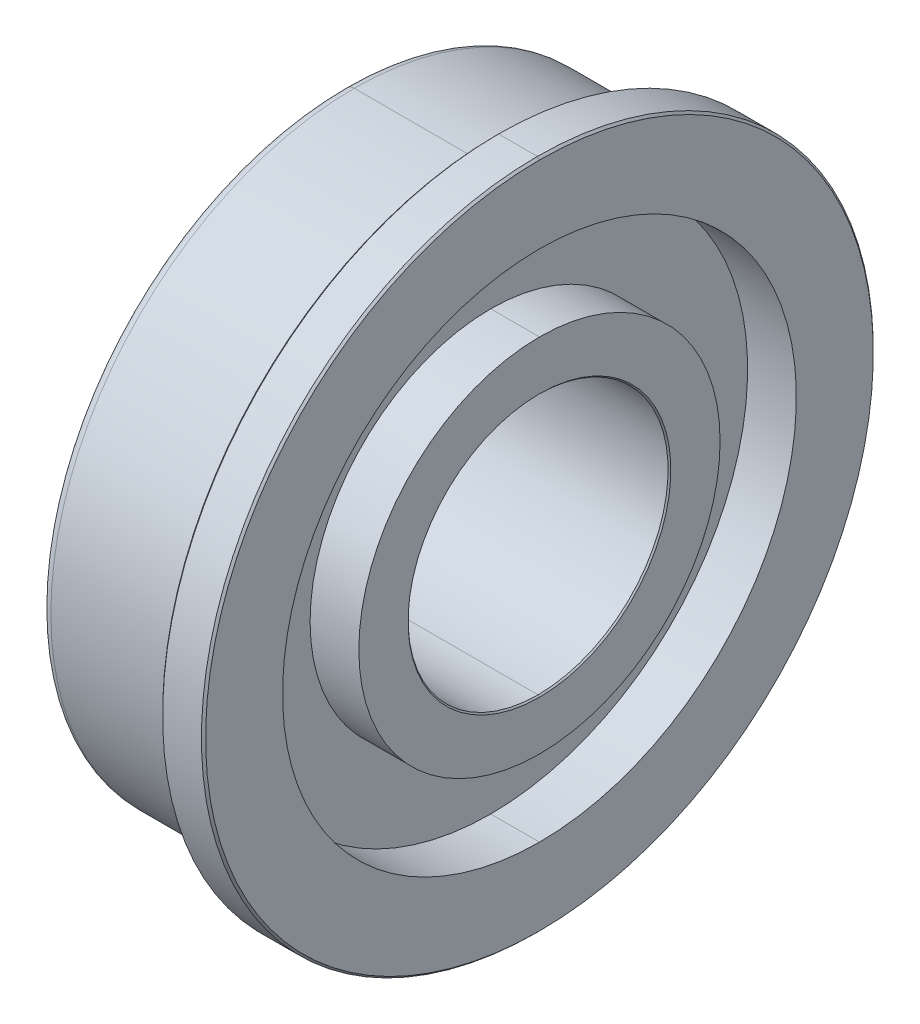
ISO-10303-21;
HEADER;
FILE_DESCRIPTION(('STEP AP214'),'2;1');
FILE_NAME('part.step','',(''),(''),'','','');
FILE_SCHEMA(('AUTOMOTIVE_DESIGN { 1 0 10303 214 1 1 1 1 }'));
ENDSEC;
DATA;
#1=APPLICATION_CONTEXT('core data for automotive mechanical design processes');
#2=APPLICATION_PROTOCOL_DEFINITION('international standard','automotive_design',2000,#1);
#3=PRODUCT_CONTEXT('',#1,'mechanical');
#4=PRODUCT('Part','Part','',(#3));
#5=PRODUCT_RELATED_PRODUCT_CATEGORY('part','',(#4));
#6=PRODUCT_DEFINITION_FORMATION('','',#4);
#7=PRODUCT_DEFINITION_CONTEXT('part definition',#1,'design');
#8=PRODUCT_DEFINITION('design','',#6,#7);
#9=PRODUCT_DEFINITION_SHAPE('','',#8);
#10=(LENGTH_UNIT() NAMED_UNIT(*) SI_UNIT(.MILLI.,.METRE.));
#11=(NAMED_UNIT(*) PLANE_ANGLE_UNIT() SI_UNIT($,.RADIAN.));
#12=(NAMED_UNIT(*) SI_UNIT($,.STERADIAN.) SOLID_ANGLE_UNIT());
#13=UNCERTAINTY_MEASURE_WITH_UNIT(LENGTH_MEASURE(1.E-05),#10,'distance_accuracy_value','');
#14=(GEOMETRIC_REPRESENTATION_CONTEXT(3) GLOBAL_UNCERTAINTY_ASSIGNED_CONTEXT((#13)) GLOBAL_UNIT_ASSIGNED_CONTEXT((#10,
#11,#12)) REPRESENTATION_CONTEXT('',''));
#15=CARTESIAN_POINT('',(0.,0.,0.));
#16=DIRECTION('',(0.,0.,1.));
#17=DIRECTION('',(1.,0.,0.));
#18=AXIS2_PLACEMENT_3D('',#15,#16,#17);
#19=CARTESIAN_POINT('',(-3.54584,0.,0.));
#20=DIRECTION('',(-1.,0.,0.));
#21=DIRECTION('',(0.,1.,0.));
#22=AXIS2_PLACEMENT_3D('',#19,#20,#21);
#23=CONICAL_SURFACE('',#22,4.7879,0.7853981633973);
#24=CARTESIAN_POINT('',(-3.57124,0.,0.));
#25=DIRECTION('',(-1.,0.,0.));
#26=DIRECTION('',(0.,1.,0.));
#27=AXIS2_PLACEMENT_3D('',#24,#25,#26);
#28=CIRCLE('',#27,4.8133);
#29=CARTESIAN_POINT('',(-3.57124,4.8133,0.));
#30=VERTEX_POINT('',#29);
#31=CARTESIAN_POINT('',(-3.57124,-4.8133,0.));
#32=VERTEX_POINT('',#31);
#33=EDGE_CURVE('E204',#30,#32,#28,.T.);
#34=ORIENTED_EDGE('',*,*,#33,.T.);
#35=DIRECTION('',(0.707106781186497,0.707106781186598,0.));
#36=VECTOR('',#35,1.);
#37=CARTESIAN_POINT('',(-3.57124,-4.8133,0.));
#38=LINE('',#37,#36);
#39=CARTESIAN_POINT('',(-3.52044,-4.7625,0.));
#40=VERTEX_POINT('',#39);
#41=EDGE_CURVE('E28',#32,#40,#38,.T.);
#42=ORIENTED_EDGE('',*,*,#41,.T.);
#43=CARTESIAN_POINT('',(-3.52044,0.,0.));
#44=DIRECTION('',(-1.,0.,0.));
#45=DIRECTION('',(0.,1.,0.));
#46=AXIS2_PLACEMENT_3D('',#43,#44,#45);
#47=CIRCLE('',#46,4.7625);
#48=CARTESIAN_POINT('',(-3.52044,4.7625,0.));
#49=VERTEX_POINT('',#48);
#50=EDGE_CURVE('E271',#49,#40,#47,.T.);
#51=ORIENTED_EDGE('',*,*,#50,.F.);
#52=DIRECTION('',(0.707106781186497,-0.707106781186598,0.));
#53=VECTOR('',#52,1.);
#54=CARTESIAN_POINT('',(-3.57124,4.8133,0.));
#55=LINE('',#54,#53);
#56=EDGE_CURVE('E11',#30,#49,#55,.T.);
#57=ORIENTED_EDGE('',*,*,#56,.F.);
#58=EDGE_LOOP('',(#34,#42,#51,#57));
#59=FACE_BOUND('',#58,.T.);
#60=ADVANCED_FACE('F17',(#59),#23,.F.);
#61=CARTESIAN_POINT('',(-3.54584,0.,0.));
#62=DIRECTION('',(-1.,0.,0.));
#63=DIRECTION('',(0.,1.,0.));
#64=AXIS2_PLACEMENT_3D('',#61,#62,#63);
#65=CONICAL_SURFACE('',#64,4.7879,0.7853981633973);
#66=CARTESIAN_POINT('',(-3.52044,0.,0.));
#67=DIRECTION('',(1.,0.,0.));
#68=DIRECTION('',(0.,1.,0.));
#69=AXIS2_PLACEMENT_3D('',#66,#67,#68);
#70=CIRCLE('',#69,4.7625);
#71=EDGE_CURVE('E221',#49,#40,#70,.T.);
#72=ORIENTED_EDGE('',*,*,#71,.T.);
#73=ORIENTED_EDGE('',*,*,#41,.F.);
#74=CARTESIAN_POINT('',(-3.57124,0.,0.));
#75=DIRECTION('',(1.,0.,0.));
#76=DIRECTION('',(0.,1.,0.));
#77=AXIS2_PLACEMENT_3D('',#74,#75,#76);
#78=CIRCLE('',#77,4.8133);
#79=EDGE_CURVE('E234',#30,#32,#78,.T.);
#80=ORIENTED_EDGE('',*,*,#79,.F.);
#81=ORIENTED_EDGE('',*,*,#56,.T.);
#82=EDGE_LOOP('',(#72,#73,#80,#81));
#83=FACE_BOUND('',#82,.T.);
#84=ADVANCED_FACE('F483',(#83),#65,.F.);
#85=CARTESIAN_POINT('',(-3.57124,0.,0.));
#86=DIRECTION('',(1.,0.,0.));
#87=DIRECTION('',(0.,1.,0.));
#88=AXIS2_PLACEMENT_3D('',#85,#86,#87);
#89=PLANE('',#88);
#90=ORIENTED_EDGE('',*,*,#33,.F.);
#91=ORIENTED_EDGE('',*,*,#79,.T.);
#92=EDGE_LOOP('',(#90,#91));
#93=FACE_BOUND('',#92,.T.);
#94=CARTESIAN_POINT('',(-3.57124,0.,0.));
#95=DIRECTION('',(1.,0.,0.));
#96=DIRECTION('',(0.,1.,0.));
#97=AXIS2_PLACEMENT_3D('',#94,#95,#96);
#98=CIRCLE('',#97,6.6167);
#99=CARTESIAN_POINT('',(-3.57124,6.6167,0.));
#100=VERTEX_POINT('',#99);
#101=CARTESIAN_POINT('',(-3.57124,-6.6167,0.));
#102=VERTEX_POINT('',#101);
#103=EDGE_CURVE('E293',#100,#102,#98,.T.);
#104=ORIENTED_EDGE('',*,*,#103,.F.);
#105=CARTESIAN_POINT('',(-3.57124,0.,0.));
#106=DIRECTION('',(-1.,0.,0.));
#107=DIRECTION('',(0.,1.,0.));
#108=AXIS2_PLACEMENT_3D('',#105,#106,#107);
#109=CIRCLE('',#108,6.6167);
#110=EDGE_CURVE('E201',#100,#102,#109,.T.);
#111=ORIENTED_EDGE('',*,*,#110,.T.);
#112=EDGE_LOOP('',(#104,#111));
#113=FACE_BOUND('',#112,.T.);
#114=ADVANCED_FACE('F489',(#93,#113),#89,.F.);
#115=CARTESIAN_POINT('',(-3.928364,0.,0.));
#116=DIRECTION('',(1.,0.,0.));
#117=DIRECTION('',(0.,-1.,0.));
#118=AXIS2_PLACEMENT_3D('',#115,#116,#117);
#119=CYLINDRICAL_SURFACE('',#118,6.6167);
#120=CARTESIAN_POINT('',(-1.78562,0.,0.));
#121=DIRECTION('',(-1.,0.,0.));
#122=DIRECTION('',(0.,1.,0.));
#123=AXIS2_PLACEMENT_3D('',#120,#121,#122);
#124=CIRCLE('',#123,6.6167);
#125=CARTESIAN_POINT('',(-1.78562,6.6167,0.));
#126=VERTEX_POINT('',#125);
#127=CARTESIAN_POINT('',(-1.78562,-6.6167,0.));
#128=VERTEX_POINT('',#127);
#129=EDGE_CURVE('E264',#126,#128,#124,.T.);
#130=ORIENTED_EDGE('',*,*,#129,.T.);
#131=DIRECTION('',(-1.,0.,0.));
#132=VECTOR('',#131,1.);
#133=CARTESIAN_POINT('',(-1.78562,-6.6167,0.));
#134=LINE('',#133,#132);
#135=EDGE_CURVE('E323',#128,#102,#134,.T.);
#136=ORIENTED_EDGE('',*,*,#135,.T.);
#137=ORIENTED_EDGE('',*,*,#110,.F.);
#138=DIRECTION('',(-1.,0.,0.));
#139=VECTOR('',#138,1.);
#140=CARTESIAN_POINT('',(-1.78562,6.6167,0.));
#141=LINE('',#140,#139);
#142=EDGE_CURVE('E205',#126,#100,#141,.T.);
#143=ORIENTED_EDGE('',*,*,#142,.F.);
#144=EDGE_LOOP('',(#130,#136,#137,#143));
#145=FACE_BOUND('',#144,.T.);
#146=ADVANCED_FACE('F513',(#145),#119,.T.);
#147=CARTESIAN_POINT('',(-3.928364,0.,0.));
#148=DIRECTION('',(1.,0.,0.));
#149=DIRECTION('',(0.,-1.,0.));
#150=AXIS2_PLACEMENT_3D('',#147,#148,#149);
#151=CYLINDRICAL_SURFACE('',#150,6.6167);
#152=ORIENTED_EDGE('',*,*,#103,.T.);
#153=ORIENTED_EDGE('',*,*,#135,.F.);
#154=CARTESIAN_POINT('',(-1.78562,0.,0.));
#155=DIRECTION('',(1.,0.,0.));
#156=DIRECTION('',(0.,1.,0.));
#157=AXIS2_PLACEMENT_3D('',#154,#155,#156);
#158=CIRCLE('',#157,6.6167);
#159=EDGE_CURVE('E289',#126,#128,#158,.T.);
#160=ORIENTED_EDGE('',*,*,#159,.F.);
#161=ORIENTED_EDGE('',*,*,#142,.T.);
#162=EDGE_LOOP('',(#152,#153,#160,#161));
#163=FACE_BOUND('',#162,.T.);
#164=ADVANCED_FACE('F509',(#163),#151,.T.);
#165=CARTESIAN_POINT('',(-1.78562,0.,0.));
#166=DIRECTION('',(1.,0.,0.));
#167=DIRECTION('',(0.,1.,0.));
#168=AXIS2_PLACEMENT_3D('',#165,#166,#167);
#169=PLANE('',#168);
#170=ORIENTED_EDGE('',*,*,#129,.F.);
#171=ORIENTED_EDGE('',*,*,#159,.T.);
#172=EDGE_LOOP('',(#170,#171));
#173=FACE_BOUND('',#172,.T.);
#174=CARTESIAN_POINT('',(-1.78562,0.,0.));
#175=DIRECTION('',(1.,0.,0.));
#176=DIRECTION('',(0.,1.,0.));
#177=AXIS2_PLACEMENT_3D('',#174,#175,#176);
#178=CIRCLE('',#177,9.4107);
#179=CARTESIAN_POINT('',(-1.78562,9.4107,0.));
#180=VERTEX_POINT('',#179);
#181=CARTESIAN_POINT('',(-1.78562,-9.4107,0.));
#182=VERTEX_POINT('',#181);
#183=EDGE_CURVE('E214',#180,#182,#178,.T.);
#184=ORIENTED_EDGE('',*,*,#183,.F.);
#185=CARTESIAN_POINT('',(-1.78562,0.,0.));
#186=DIRECTION('',(-1.,0.,0.));
#187=DIRECTION('',(0.,1.,0.));
#188=AXIS2_PLACEMENT_3D('',#185,#186,#187);
#189=CIRCLE('',#188,9.4107);
#190=EDGE_CURVE('E260',#180,#182,#189,.T.);
#191=ORIENTED_EDGE('',*,*,#190,.T.);
#192=EDGE_LOOP('',(#184,#191));
#193=FACE_BOUND('',#192,.T.);
#194=ADVANCED_FACE('F512',(#173,#193),#169,.F.);
#195=CARTESIAN_POINT('',(-3.928364,0.,0.));
#196=DIRECTION('',(1.,0.,0.));
#197=DIRECTION('',(0.,-1.,0.));
#198=AXIS2_PLACEMENT_3D('',#195,#196,#197);
#199=CYLINDRICAL_SURFACE('',#198,9.4107);
#200=CARTESIAN_POINT('',(-3.57124,0.,0.));
#201=DIRECTION('',(-1.,0.,0.));
#202=DIRECTION('',(0.,1.,0.));
#203=AXIS2_PLACEMENT_3D('',#200,#201,#202);
#204=CIRCLE('',#203,9.4107);
#205=CARTESIAN_POINT('',(-3.57124,9.4107,0.));
#206=VERTEX_POINT('',#205);
#207=CARTESIAN_POINT('',(-3.57124,-9.4107,0.));
#208=VERTEX_POINT('',#207);
#209=EDGE_CURVE('E215',#206,#208,#204,.T.);
#210=ORIENTED_EDGE('',*,*,#209,.T.);
#211=DIRECTION('',(1.,0.,0.));
#212=VECTOR('',#211,1.);
#213=CARTESIAN_POINT('',(-3.57124,-9.4107,0.));
#214=LINE('',#213,#212);
#215=EDGE_CURVE('E389',#208,#182,#214,.T.);
#216=ORIENTED_EDGE('',*,*,#215,.T.);
#217=ORIENTED_EDGE('',*,*,#190,.F.);
#218=DIRECTION('',(1.,0.,0.));
#219=VECTOR('',#218,1.);
#220=CARTESIAN_POINT('',(-3.57124,9.4107,0.));
#221=LINE('',#220,#219);
#222=EDGE_CURVE('E265',#206,#180,#221,.T.);
#223=ORIENTED_EDGE('',*,*,#222,.F.);
#224=EDGE_LOOP('',(#210,#216,#217,#223));
#225=FACE_BOUND('',#224,.T.);
#226=ADVANCED_FACE('F514',(#225),#199,.F.);
#227=CARTESIAN_POINT('',(-3.928364,0.,0.));
#228=DIRECTION('',(1.,0.,0.));
#229=DIRECTION('',(0.,-1.,0.));
#230=AXIS2_PLACEMENT_3D('',#227,#228,#229);
#231=CYLINDRICAL_SURFACE('',#230,9.4107);
#232=ORIENTED_EDGE('',*,*,#183,.T.);
#233=ORIENTED_EDGE('',*,*,#215,.F.);
#234=CARTESIAN_POINT('',(-3.57124,0.,0.));
#235=DIRECTION('',(1.,0.,0.));
#236=DIRECTION('',(0.,1.,0.));
#237=AXIS2_PLACEMENT_3D('',#234,#235,#236);
#238=CIRCLE('',#237,9.4107);
#239=EDGE_CURVE('E210',#206,#208,#238,.T.);
#240=ORIENTED_EDGE('',*,*,#239,.F.);
#241=ORIENTED_EDGE('',*,*,#222,.T.);
#242=EDGE_LOOP('',(#232,#233,#240,#241));
#243=FACE_BOUND('',#242,.T.);
#244=ADVANCED_FACE('F517',(#243),#231,.F.);
#245=CARTESIAN_POINT('',(-3.57124,0.,0.));
#246=DIRECTION('',(1.,0.,0.));
#247=DIRECTION('',(0.,1.,0.));
#248=AXIS2_PLACEMENT_3D('',#245,#246,#247);
#249=PLANE('',#248);
#250=ORIENTED_EDGE('',*,*,#209,.F.);
#251=ORIENTED_EDGE('',*,*,#239,.T.);
#252=EDGE_LOOP('',(#250,#251));
#253=FACE_BOUND('',#252,.T.);
#254=CARTESIAN_POINT('',(-3.57124,0.,0.));
#255=DIRECTION('',(1.,0.,0.));
#256=DIRECTION('',(0.,1.,0.));
#257=AXIS2_PLACEMENT_3D('',#254,#255,#256);
#258=CIRCLE('',#257,10.755376);
#259=CARTESIAN_POINT('',(-3.57124,10.755376,0.));
#260=VERTEX_POINT('',#259);
#261=CARTESIAN_POINT('',(-3.57124,-10.755376,0.));
#262=VERTEX_POINT('',#261);
#263=EDGE_CURVE('E303',#260,#262,#258,.T.);
#264=ORIENTED_EDGE('',*,*,#263,.F.);
#265=CARTESIAN_POINT('',(-3.57124,0.,0.));
#266=DIRECTION('',(-1.,0.,0.));
#267=DIRECTION('',(0.,1.,0.));
#268=AXIS2_PLACEMENT_3D('',#265,#266,#267);
#269=CIRCLE('',#268,10.755376);
#270=EDGE_CURVE('E226',#260,#262,#269,.T.);
#271=ORIENTED_EDGE('',*,*,#270,.T.);
#272=EDGE_LOOP('',(#264,#271));
#273=FACE_BOUND('',#272,.T.);
#274=ADVANCED_FACE('F523',(#253,#273),#249,.F.);
#275=CARTESIAN_POINT('',(-3.214116,0.,0.));
#276=DIRECTION('',(1.,0.,0.));
#277=DIRECTION('',(0.,-1.,0.));
#278=AXIS2_PLACEMENT_3D('',#275,#276,#277);
#279=TOROIDAL_SURFACE('',#278,10.755376,0.357124);
#280=ORIENTED_EDGE('',*,*,#263,.T.);
#281=CARTESIAN_POINT('',(-3.214116,-10.755376,0.));
#282=DIRECTION('',(0.,0.,-1.));
#283=DIRECTION('',(0.,-1.,0.));
#284=AXIS2_PLACEMENT_3D('',#281,#282,#283);
#285=CIRCLE('',#284,0.357124);
#286=CARTESIAN_POINT('',(-3.214116,-11.1125,0.));
#287=VERTEX_POINT('',#286);
#288=EDGE_CURVE('E21',#287,#262,#285,.T.);
#289=ORIENTED_EDGE('',*,*,#288,.F.);
#290=CARTESIAN_POINT('',(-3.214116,0.,0.));
#291=DIRECTION('',(1.,0.,0.));
#292=DIRECTION('',(0.,1.,0.));
#293=AXIS2_PLACEMENT_3D('',#290,#291,#292);
#294=CIRCLE('',#293,11.1125);
#295=CARTESIAN_POINT('',(-3.214116,11.1125,0.));
#296=VERTEX_POINT('',#295);
#297=EDGE_CURVE('E254',#296,#287,#294,.T.);
#298=ORIENTED_EDGE('',*,*,#297,.F.);
#299=CARTESIAN_POINT('',(-3.214116,10.755376,0.));
#300=DIRECTION('',(0.,0.,1.));
#301=DIRECTION('',(0.,1.,0.));
#302=AXIS2_PLACEMENT_3D('',#299,#300,#301);
#303=CIRCLE('',#302,0.357124);
#304=EDGE_CURVE('E230',#296,#260,#303,.T.);
#305=ORIENTED_EDGE('',*,*,#304,.T.);
#306=EDGE_LOOP('',(#280,#289,#298,#305));
#307=FACE_BOUND('',#306,.T.);
#308=ADVANCED_FACE('F415',(#307),#279,.T.);
#309=CARTESIAN_POINT('',(-3.214116,0.,0.));
#310=DIRECTION('',(1.,0.,0.));
#311=DIRECTION('',(0.,-1.,0.));
#312=AXIS2_PLACEMENT_3D('',#309,#310,#311);
#313=TOROIDAL_SURFACE('',#312,10.755376,0.357124);
#314=CARTESIAN_POINT('',(-3.214116,0.,0.));
#315=DIRECTION('',(-1.,0.,0.));
#316=DIRECTION('',(0.,1.,0.));
#317=AXIS2_PLACEMENT_3D('',#314,#315,#316);
#318=CIRCLE('',#317,11.1125);
#319=EDGE_CURVE('E266',#296,#287,#318,.T.);
#320=ORIENTED_EDGE('',*,*,#319,.T.);
#321=ORIENTED_EDGE('',*,*,#288,.T.);
#322=ORIENTED_EDGE('',*,*,#270,.F.);
#323=ORIENTED_EDGE('',*,*,#304,.F.);
#324=EDGE_LOOP('',(#320,#321,#322,#323));
#325=FACE_BOUND('',#324,.T.);
#326=ADVANCED_FACE('F421',(#325),#313,.T.);
#327=CARTESIAN_POINT('',(-3.928364,0.,0.));
#328=DIRECTION('',(1.,0.,0.));
#329=DIRECTION('',(0.,-1.,0.));
#330=AXIS2_PLACEMENT_3D('',#327,#328,#329);
#331=CYLINDRICAL_SURFACE('',#330,11.1125);
#332=CARTESIAN_POINT('',(1.99644,0.,0.));
#333=DIRECTION('',(-1.,0.,0.));
#334=DIRECTION('',(0.,1.,0.));
#335=AXIS2_PLACEMENT_3D('',#332,#333,#334);
#336=CIRCLE('',#335,11.1125);
#337=CARTESIAN_POINT('',(1.99644,11.1125,0.));
#338=VERTEX_POINT('',#337);
#339=CARTESIAN_POINT('',(1.99644,-11.1125,0.));
#340=VERTEX_POINT('',#339);
#341=EDGE_CURVE('E248',#338,#340,#336,.T.);
#342=ORIENTED_EDGE('',*,*,#341,.T.);
#343=DIRECTION('',(-1.,0.,0.));
#344=VECTOR('',#343,1.);
#345=CARTESIAN_POINT('',(1.99644,-11.1125,0.));
#346=LINE('',#345,#344);
#347=EDGE_CURVE('E258',#340,#287,#346,.T.);
#348=ORIENTED_EDGE('',*,*,#347,.T.);
#349=ORIENTED_EDGE('',*,*,#319,.F.);
#350=DIRECTION('',(-1.,0.,0.));
#351=VECTOR('',#350,1.);
#352=CARTESIAN_POINT('',(1.99644,11.1125,0.));
#353=LINE('',#352,#351);
#354=EDGE_CURVE('E270',#338,#296,#353,.T.);
#355=ORIENTED_EDGE('',*,*,#354,.F.);
#356=EDGE_LOOP('',(#342,#348,#349,#355));
#357=FACE_BOUND('',#356,.T.);
#358=ADVANCED_FACE('F422',(#357),#331,.T.);
#359=CARTESIAN_POINT('',(-3.928364,0.,0.));
#360=DIRECTION('',(1.,0.,0.));
#361=DIRECTION('',(0.,-1.,0.));
#362=AXIS2_PLACEMENT_3D('',#359,#360,#361);
#363=CYLINDRICAL_SURFACE('',#362,11.1125);
#364=ORIENTED_EDGE('',*,*,#297,.T.);
#365=ORIENTED_EDGE('',*,*,#347,.F.);
#366=CARTESIAN_POINT('',(1.99644,0.,0.));
#367=DIRECTION('',(1.,0.,0.));
#368=DIRECTION('',(0.,1.,0.));
#369=AXIS2_PLACEMENT_3D('',#366,#367,#368);
#370=CIRCLE('',#369,11.1125);
#371=EDGE_CURVE('E259',#338,#340,#370,.T.);
#372=ORIENTED_EDGE('',*,*,#371,.F.);
#373=ORIENTED_EDGE('',*,*,#354,.T.);
#374=EDGE_LOOP('',(#364,#365,#372,#373));
#375=FACE_BOUND('',#374,.T.);
#376=ADVANCED_FACE('F19',(#375),#363,.T.);
#377=CARTESIAN_POINT('',(1.99644,0.,0.));
#378=DIRECTION('',(1.,0.,0.));
#379=DIRECTION('',(0.,1.,0.));
#380=AXIS2_PLACEMENT_3D('',#377,#378,#379);
#381=PLANE('',#380);
#382=ORIENTED_EDGE('',*,*,#341,.F.);
#383=ORIENTED_EDGE('',*,*,#371,.T.);
#384=EDGE_LOOP('',(#382,#383));
#385=FACE_BOUND('',#384,.T.);
#386=CARTESIAN_POINT('',(1.99644,0.,0.));
#387=DIRECTION('',(1.,0.,0.));
#388=DIRECTION('',(0.,1.,0.));
#389=AXIS2_PLACEMENT_3D('',#386,#387,#388);
#390=CIRCLE('',#389,12.2301);
#391=CARTESIAN_POINT('',(1.99644,12.2301,0.));
#392=VERTEX_POINT('',#391);
#393=CARTESIAN_POINT('',(1.99644,-12.2301,0.));
#394=VERTEX_POINT('',#393);
#395=EDGE_CURVE('E320',#392,#394,#390,.T.);
#396=ORIENTED_EDGE('',*,*,#395,.F.);
#397=CARTESIAN_POINT('',(1.99644,0.,0.));
#398=DIRECTION('',(-1.,0.,0.));
#399=DIRECTION('',(0.,1.,0.));
#400=AXIS2_PLACEMENT_3D('',#397,#398,#399);
#401=CIRCLE('',#400,12.2301);
#402=EDGE_CURVE('E245',#392,#394,#401,.T.);
#403=ORIENTED_EDGE('',*,*,#402,.T.);
#404=EDGE_LOOP('',(#396,#403));
#405=FACE_BOUND('',#404,.T.);
#406=ADVANCED_FACE('F424',(#385,#405),#381,.F.);
#407=CARTESIAN_POINT('',(2.03454,0.,0.));
#408=DIRECTION('',(1.,0.,0.));
#409=DIRECTION('',(0.,-1.,0.));
#410=AXIS2_PLACEMENT_3D('',#407,#408,#409);
#411=CONICAL_SURFACE('',#410,12.2682,0.7853981633973);
#412=CARTESIAN_POINT('',(2.07264,0.,0.));
#413=DIRECTION('',(-1.,0.,0.));
#414=DIRECTION('',(0.,1.,0.));
#415=AXIS2_PLACEMENT_3D('',#412,#413,#414);
#416=CIRCLE('',#415,12.3063);
#417=CARTESIAN_POINT('',(2.07264,12.3063,0.));
#418=VERTEX_POINT('',#417);
#419=CARTESIAN_POINT('',(2.07264,-12.3063,0.));
#420=VERTEX_POINT('',#419);
#421=EDGE_CURVE('E199',#418,#420,#416,.T.);
#422=ORIENTED_EDGE('',*,*,#421,.T.);
#423=DIRECTION('',(-0.707106781186498,0.707106781186597,0.));
#424=VECTOR('',#423,1.);
#425=CARTESIAN_POINT('',(2.07264,-12.3063,0.));
#426=LINE('',#425,#424);
#427=EDGE_CURVE('E317',#420,#394,#426,.T.);
#428=ORIENTED_EDGE('',*,*,#427,.T.);
#429=ORIENTED_EDGE('',*,*,#402,.F.);
#430=DIRECTION('',(-0.707106781186498,-0.707106781186597,0.));
#431=VECTOR('',#430,1.);
#432=CARTESIAN_POINT('',(2.07264,12.3063,0.));
#433=LINE('',#432,#431);
#434=EDGE_CURVE('E249',#418,#392,#433,.T.);
#435=ORIENTED_EDGE('',*,*,#434,.F.);
#436=EDGE_LOOP('',(#422,#428,#429,#435));
#437=FACE_BOUND('',#436,.T.);
#438=ADVANCED_FACE('F443',(#437),#411,.T.);
#439=CARTESIAN_POINT('',(2.03454,0.,0.));
#440=DIRECTION('',(1.,0.,0.));
#441=DIRECTION('',(0.,-1.,0.));
#442=AXIS2_PLACEMENT_3D('',#439,#440,#441);
#443=CONICAL_SURFACE('',#442,12.2682,0.7853981633973);
#444=ORIENTED_EDGE('',*,*,#395,.T.);
#445=ORIENTED_EDGE('',*,*,#427,.F.);
#446=CARTESIAN_POINT('',(2.07264,0.,0.));
#447=DIRECTION('',(1.,0.,0.));
#448=DIRECTION('',(0.,1.,0.));
#449=AXIS2_PLACEMENT_3D('',#446,#447,#448);
#450=CIRCLE('',#449,12.3063);
#451=EDGE_CURVE('E220',#418,#420,#450,.T.);
#452=ORIENTED_EDGE('',*,*,#451,.F.);
#453=ORIENTED_EDGE('',*,*,#434,.T.);
#454=EDGE_LOOP('',(#444,#445,#452,#453));
#455=FACE_BOUND('',#454,.T.);
#456=ADVANCED_FACE('F471',(#455),#443,.T.);
#457=CARTESIAN_POINT('',(-3.928364,0.,0.));
#458=DIRECTION('',(1.,0.,0.));
#459=DIRECTION('',(0.,-1.,0.));
#460=AXIS2_PLACEMENT_3D('',#457,#458,#459);
#461=CYLINDRICAL_SURFACE('',#460,12.3063);
#462=ORIENTED_EDGE('',*,*,#451,.T.);
#463=DIRECTION('',(-1.,0.,0.));
#464=VECTOR('',#463,1.);
#465=CARTESIAN_POINT('',(3.49504,-12.3063,0.));
#466=LINE('',#465,#464);
#467=CARTESIAN_POINT('',(3.49504,-12.3063,0.));
#468=VERTEX_POINT('',#467);
#469=EDGE_CURVE('E195',#468,#420,#466,.T.);
#470=ORIENTED_EDGE('',*,*,#469,.F.);
#471=CARTESIAN_POINT('',(3.49504,0.,0.));
#472=DIRECTION('',(1.,0.,0.));
#473=DIRECTION('',(0.,1.,0.));
#474=AXIS2_PLACEMENT_3D('',#471,#472,#473);
#475=CIRCLE('',#474,12.3063);
#476=CARTESIAN_POINT('',(3.49504,12.3063,0.));
#477=VERTEX_POINT('',#476);
#478=EDGE_CURVE('E299',#477,#468,#475,.T.);
#479=ORIENTED_EDGE('',*,*,#478,.F.);
#480=DIRECTION('',(-1.,0.,0.));
#481=VECTOR('',#480,1.);
#482=CARTESIAN_POINT('',(3.49504,12.3063,0.));
#483=LINE('',#482,#481);
#484=EDGE_CURVE('E216',#477,#418,#483,.T.);
#485=ORIENTED_EDGE('',*,*,#484,.T.);
#486=EDGE_LOOP('',(#462,#470,#479,#485));
#487=FACE_BOUND('',#486,.T.);
#488=ADVANCED_FACE('F438',(#487),#461,.T.);
#489=CARTESIAN_POINT('',(-3.928364,0.,0.));
#490=DIRECTION('',(1.,0.,0.));
#491=DIRECTION('',(0.,-1.,0.));
#492=AXIS2_PLACEMENT_3D('',#489,#490,#491);
#493=CYLINDRICAL_SURFACE('',#492,12.3063);
#494=CARTESIAN_POINT('',(3.49504,0.,0.));
#495=DIRECTION('',(-1.,0.,0.));
#496=DIRECTION('',(0.,1.,0.));
#497=AXIS2_PLACEMENT_3D('',#494,#495,#496);
#498=CIRCLE('',#497,12.3063);
#499=EDGE_CURVE('E200',#477,#468,#498,.T.);
#500=ORIENTED_EDGE('',*,*,#499,.T.);
#501=ORIENTED_EDGE('',*,*,#469,.T.);
#502=ORIENTED_EDGE('',*,*,#421,.F.);
#503=ORIENTED_EDGE('',*,*,#484,.F.);
#504=EDGE_LOOP('',(#500,#501,#502,#503));
#505=FACE_BOUND('',#504,.T.);
#506=ADVANCED_FACE('F446',(#505),#493,.T.);
#507=CARTESIAN_POINT('',(3.53314,0.,0.));
#508=DIRECTION('',(-1.,0.,0.));
#509=DIRECTION('',(0.,1.,0.));
#510=AXIS2_PLACEMENT_3D('',#507,#508,#509);
#511=CONICAL_SURFACE('',#510,12.2682,0.7853981633973);
#512=CARTESIAN_POINT('',(3.57124,0.,0.));
#513=DIRECTION('',(-1.,0.,0.));
#514=DIRECTION('',(0.,1.,0.));
#515=AXIS2_PLACEMENT_3D('',#512,#513,#514);
#516=CIRCLE('',#515,12.2301);
#517=CARTESIAN_POINT('',(3.57124,12.2301,0.));
#518=VERTEX_POINT('',#517);
#519=CARTESIAN_POINT('',(3.57124,-12.2301,0.));
#520=VERTEX_POINT('',#519);
#521=EDGE_CURVE('E276',#518,#520,#516,.T.);
#522=ORIENTED_EDGE('',*,*,#521,.T.);
#523=DIRECTION('',(-0.707106781186498,-0.707106781186597,0.));
#524=VECTOR('',#523,1.);
#525=CARTESIAN_POINT('',(3.57124,-12.2301,0.));
#526=LINE('',#525,#524);
#527=EDGE_CURVE('E294',#520,#468,#526,.T.);
#528=ORIENTED_EDGE('',*,*,#527,.T.);
#529=ORIENTED_EDGE('',*,*,#499,.F.);
#530=DIRECTION('',(-0.707106781186498,0.707106781186597,0.));
#531=VECTOR('',#530,1.);
#532=CARTESIAN_POINT('',(3.57124,12.2301,0.));
#533=LINE('',#532,#531);
#534=EDGE_CURVE('E298',#518,#477,#533,.T.);
#535=ORIENTED_EDGE('',*,*,#534,.F.);
#536=EDGE_LOOP('',(#522,#528,#529,#535));
#537=FACE_BOUND('',#536,.T.);
#538=ADVANCED_FACE('F452',(#537),#511,.T.);
#539=CARTESIAN_POINT('',(3.53314,0.,0.));
#540=DIRECTION('',(-1.,0.,0.));
#541=DIRECTION('',(0.,1.,0.));
#542=AXIS2_PLACEMENT_3D('',#539,#540,#541);
#543=CONICAL_SURFACE('',#542,12.2682,0.7853981633973);
#544=ORIENTED_EDGE('',*,*,#478,.T.);
#545=ORIENTED_EDGE('',*,*,#527,.F.);
#546=CARTESIAN_POINT('',(3.57124,0.,0.));
#547=DIRECTION('',(1.,0.,0.));
#548=DIRECTION('',(0.,1.,0.));
#549=AXIS2_PLACEMENT_3D('',#546,#547,#548);
#550=CIRCLE('',#549,12.2301);
#551=EDGE_CURVE('E279',#518,#520,#550,.T.);
#552=ORIENTED_EDGE('',*,*,#551,.F.);
#553=ORIENTED_EDGE('',*,*,#534,.T.);
#554=EDGE_LOOP('',(#544,#545,#552,#553));
#555=FACE_BOUND('',#554,.T.);
#556=ADVANCED_FACE('F456',(#555),#543,.T.);
#557=CARTESIAN_POINT('',(3.57124,0.,0.));
#558=DIRECTION('',(1.,0.,0.));
#559=DIRECTION('',(0.,1.,0.));
#560=AXIS2_PLACEMENT_3D('',#557,#558,#559);
#561=PLANE('',#560);
#562=CARTESIAN_POINT('',(3.57124,0.,0.));
#563=DIRECTION('',(1.,0.,0.));
#564=DIRECTION('',(0.,1.,0.));
#565=AXIS2_PLACEMENT_3D('',#562,#563,#564);
#566=CIRCLE('',#565,9.4107);
#567=CARTESIAN_POINT('',(3.57124,9.4107,0.));
#568=VERTEX_POINT('',#567);
#569=CARTESIAN_POINT('',(3.57124,-9.4107,0.));
#570=VERTEX_POINT('',#569);
#571=EDGE_CURVE('E171',#568,#570,#566,.T.);
#572=ORIENTED_EDGE('',*,*,#571,.F.);
#573=CARTESIAN_POINT('',(3.57124,0.,0.));
#574=DIRECTION('',(-1.,0.,0.));
#575=DIRECTION('',(0.,1.,0.));
#576=AXIS2_PLACEMENT_3D('',#573,#574,#575);
#577=CIRCLE('',#576,9.4107);
#578=EDGE_CURVE('E280',#568,#570,#577,.T.);
#579=ORIENTED_EDGE('',*,*,#578,.T.);
#580=EDGE_LOOP('',(#572,#579));
#581=FACE_BOUND('',#580,.T.);
#582=ORIENTED_EDGE('',*,*,#521,.F.);
#583=ORIENTED_EDGE('',*,*,#551,.T.);
#584=EDGE_LOOP('',(#582,#583));
#585=FACE_BOUND('',#584,.T.);
#586=ADVANCED_FACE('F519',(#581,#585),#561,.T.);
#587=CARTESIAN_POINT('',(-3.928364,0.,0.));
#588=DIRECTION('',(1.,0.,0.));
#589=DIRECTION('',(0.,-1.,0.));
#590=AXIS2_PLACEMENT_3D('',#587,#588,#589);
#591=CYLINDRICAL_SURFACE('',#590,9.4107);
#592=CARTESIAN_POINT('',(1.78562,0.,0.));
#593=DIRECTION('',(-1.,0.,0.));
#594=DIRECTION('',(0.,1.,0.));
#595=AXIS2_PLACEMENT_3D('',#592,#593,#594);
#596=CIRCLE('',#595,9.4107);
#597=CARTESIAN_POINT('',(1.78562,9.4107,0.));
#598=VERTEX_POINT('',#597);
#599=CARTESIAN_POINT('',(1.78562,-9.4107,0.));
#600=VERTEX_POINT('',#599);
#601=EDGE_CURVE('E179',#598,#600,#596,.T.);
#602=ORIENTED_EDGE('',*,*,#601,.T.);
#603=DIRECTION('',(1.,0.,0.));
#604=VECTOR('',#603,1.);
#605=CARTESIAN_POINT('',(1.78562,-9.4107,0.));
#606=LINE('',#605,#604);
#607=EDGE_CURVE('E164',#600,#570,#606,.T.);
#608=ORIENTED_EDGE('',*,*,#607,.T.);
#609=ORIENTED_EDGE('',*,*,#578,.F.);
#610=DIRECTION('',(1.,0.,0.));
#611=VECTOR('',#610,1.);
#612=CARTESIAN_POINT('',(1.78562,9.4107,0.));
#613=LINE('',#612,#611);
#614=EDGE_CURVE('E175',#598,#568,#613,.T.);
#615=ORIENTED_EDGE('',*,*,#614,.F.);
#616=EDGE_LOOP('',(#602,#608,#609,#615));
#617=FACE_BOUND('',#616,.T.);
#618=ADVANCED_FACE('F182',(#617),#591,.F.);
#619=CARTESIAN_POINT('',(-3.928364,0.,0.));
#620=DIRECTION('',(1.,0.,0.));
#621=DIRECTION('',(0.,-1.,0.));
#622=AXIS2_PLACEMENT_3D('',#619,#620,#621);
#623=CYLINDRICAL_SURFACE('',#622,9.4107);
#624=ORIENTED_EDGE('',*,*,#571,.T.);
#625=ORIENTED_EDGE('',*,*,#607,.F.);
#626=CARTESIAN_POINT('',(1.78562,0.,0.));
#627=DIRECTION('',(1.,0.,0.));
#628=DIRECTION('',(0.,1.,0.));
#629=AXIS2_PLACEMENT_3D('',#626,#627,#628);
#630=CIRCLE('',#629,9.4107);
#631=EDGE_CURVE('E168',#598,#600,#630,.T.);
#632=ORIENTED_EDGE('',*,*,#631,.F.);
#633=ORIENTED_EDGE('',*,*,#614,.T.);
#634=EDGE_LOOP('',(#624,#625,#632,#633));
#635=FACE_BOUND('',#634,.T.);
#636=ADVANCED_FACE('F166',(#635),#623,.F.);
#637=CARTESIAN_POINT('',(1.78562,0.,0.));
#638=DIRECTION('',(1.,0.,0.));
#639=DIRECTION('',(0.,1.,0.));
#640=AXIS2_PLACEMENT_3D('',#637,#638,#639);
#641=PLANE('',#640);
#642=CARTESIAN_POINT('',(1.78562,0.,0.));
#643=DIRECTION('',(1.,0.,0.));
#644=DIRECTION('',(0.,1.,0.));
#645=AXIS2_PLACEMENT_3D('',#642,#643,#644);
#646=CIRCLE('',#645,6.6167);
#647=CARTESIAN_POINT('',(1.78562,6.6167,0.));
#648=VERTEX_POINT('',#647);
#649=CARTESIAN_POINT('',(1.78562,-6.6167,0.));
#650=VERTEX_POINT('',#649);
#651=EDGE_CURVE('E253',#648,#650,#646,.T.);
#652=ORIENTED_EDGE('',*,*,#651,.F.);
#653=CARTESIAN_POINT('',(1.78562,0.,0.));
#654=DIRECTION('',(-1.,0.,0.));
#655=DIRECTION('',(0.,1.,0.));
#656=AXIS2_PLACEMENT_3D('',#653,#654,#655);
#657=CIRCLE('',#656,6.6167);
#658=EDGE_CURVE('E184',#648,#650,#657,.T.);
#659=ORIENTED_EDGE('',*,*,#658,.T.);
#660=EDGE_LOOP('',(#652,#659));
#661=FACE_BOUND('',#660,.T.);
#662=ORIENTED_EDGE('',*,*,#601,.F.);
#663=ORIENTED_EDGE('',*,*,#631,.T.);
#664=EDGE_LOOP('',(#662,#663));
#665=FACE_BOUND('',#664,.T.);
#666=ADVANCED_FACE('F178',(#661,#665),#641,.T.);
#667=CARTESIAN_POINT('',(-3.928364,0.,0.));
#668=DIRECTION('',(1.,0.,0.));
#669=DIRECTION('',(0.,-1.,0.));
#670=AXIS2_PLACEMENT_3D('',#667,#668,#669);
#671=CYLINDRICAL_SURFACE('',#670,6.6167);
#672=CARTESIAN_POINT('',(3.57124,0.,0.));
#673=DIRECTION('',(-1.,0.,0.));
#674=DIRECTION('',(0.,1.,0.));
#675=AXIS2_PLACEMENT_3D('',#672,#673,#674);
#676=CIRCLE('',#675,6.6167);
#677=CARTESIAN_POINT('',(3.57124,6.6167,0.));
#678=VERTEX_POINT('',#677);
#679=CARTESIAN_POINT('',(3.57124,-6.6167,0.));
#680=VERTEX_POINT('',#679);
#681=EDGE_CURVE('E350',#678,#680,#676,.T.);
#682=ORIENTED_EDGE('',*,*,#681,.T.);
#683=DIRECTION('',(-1.,0.,0.));
#684=VECTOR('',#683,1.);
#685=CARTESIAN_POINT('',(3.57124,-6.6167,0.));
#686=LINE('',#685,#684);
#687=EDGE_CURVE('E209',#680,#650,#686,.T.);
#688=ORIENTED_EDGE('',*,*,#687,.T.);
#689=ORIENTED_EDGE('',*,*,#658,.F.);
#690=DIRECTION('',(-1.,0.,0.));
#691=VECTOR('',#690,1.);
#692=CARTESIAN_POINT('',(3.57124,6.6167,0.));
#693=LINE('',#692,#691);
#694=EDGE_CURVE('E190',#678,#648,#693,.T.);
#695=ORIENTED_EDGE('',*,*,#694,.F.);
#696=EDGE_LOOP('',(#682,#688,#689,#695));
#697=FACE_BOUND('',#696,.T.);
#698=ADVANCED_FACE('F761',(#697),#671,.T.);
#699=CARTESIAN_POINT('',(-3.928364,0.,0.));
#700=DIRECTION('',(1.,0.,0.));
#701=DIRECTION('',(0.,-1.,0.));
#702=AXIS2_PLACEMENT_3D('',#699,#700,#701);
#703=CYLINDRICAL_SURFACE('',#702,6.6167);
#704=ORIENTED_EDGE('',*,*,#651,.T.);
#705=ORIENTED_EDGE('',*,*,#687,.F.);
#706=CARTESIAN_POINT('',(3.57124,0.,0.));
#707=DIRECTION('',(1.,0.,0.));
#708=DIRECTION('',(0.,1.,0.));
#709=AXIS2_PLACEMENT_3D('',#706,#707,#708);
#710=CIRCLE('',#709,6.6167);
#711=EDGE_CURVE('E354',#678,#680,#710,.T.);
#712=ORIENTED_EDGE('',*,*,#711,.F.);
#713=ORIENTED_EDGE('',*,*,#694,.T.);
#714=EDGE_LOOP('',(#704,#705,#712,#713));
#715=FACE_BOUND('',#714,.T.);
#716=ADVANCED_FACE('F493',(#715),#703,.T.);
#717=CARTESIAN_POINT('',(3.57124,0.,0.));
#718=DIRECTION('',(1.,0.,0.));
#719=DIRECTION('',(0.,1.,0.));
#720=AXIS2_PLACEMENT_3D('',#717,#718,#719);
#721=PLANE('',#720);
#722=CARTESIAN_POINT('',(3.57124,0.,0.));
#723=DIRECTION('',(1.,0.,0.));
#724=DIRECTION('',(0.,1.,0.));
#725=AXIS2_PLACEMENT_3D('',#722,#723,#724);
#726=CIRCLE('',#725,4.8133);
#727=CARTESIAN_POINT('',(3.57124,4.8133,0.));
#728=VERTEX_POINT('',#727);
#729=CARTESIAN_POINT('',(3.57124,-4.8133,0.));
#730=VERTEX_POINT('',#729);
#731=EDGE_CURVE('E313',#728,#730,#726,.T.);
#732=ORIENTED_EDGE('',*,*,#731,.F.);
#733=CARTESIAN_POINT('',(3.57124,0.,0.));
#734=DIRECTION('',(-1.,0.,0.));
#735=DIRECTION('',(0.,1.,0.));
#736=AXIS2_PLACEMENT_3D('',#733,#734,#735);
#737=CIRCLE('',#736,4.8133);
#738=EDGE_CURVE('E239',#728,#730,#737,.T.);
#739=ORIENTED_EDGE('',*,*,#738,.T.);
#740=EDGE_LOOP('',(#732,#739));
#741=FACE_BOUND('',#740,.T.);
#742=ORIENTED_EDGE('',*,*,#681,.F.);
#743=ORIENTED_EDGE('',*,*,#711,.T.);
#744=EDGE_LOOP('',(#742,#743));
#745=FACE_BOUND('',#744,.T.);
#746=ADVANCED_FACE('F528',(#741,#745),#721,.T.);
#747=CARTESIAN_POINT('',(3.54584,0.,0.));
#748=DIRECTION('',(1.,0.,0.));
#749=DIRECTION('',(0.,-1.,0.));
#750=AXIS2_PLACEMENT_3D('',#747,#748,#749);
#751=CONICAL_SURFACE('',#750,4.7879,0.7853981633973);
#752=ORIENTED_EDGE('',*,*,#731,.T.);
#753=DIRECTION('',(0.707106781186497,-0.707106781186598,0.));
#754=VECTOR('',#753,1.);
#755=CARTESIAN_POINT('',(3.52044,-4.7625,0.));
#756=LINE('',#755,#754);
#757=CARTESIAN_POINT('',(3.52044,-4.7625,0.));
#758=VERTEX_POINT('',#757);
#759=EDGE_CURVE('E244',#758,#730,#756,.T.);
#760=ORIENTED_EDGE('',*,*,#759,.F.);
#761=CARTESIAN_POINT('',(3.52044,0.,0.));
#762=DIRECTION('',(1.,0.,0.));
#763=DIRECTION('',(0.,1.,0.));
#764=AXIS2_PLACEMENT_3D('',#761,#762,#763);
#765=CIRCLE('',#764,4.7625);
#766=CARTESIAN_POINT('',(3.52044,4.7625,0.));
#767=VERTEX_POINT('',#766);
#768=EDGE_CURVE('E235',#767,#758,#765,.T.);
#769=ORIENTED_EDGE('',*,*,#768,.F.);
#770=DIRECTION('',(0.707106781186497,0.707106781186598,0.));
#771=VECTOR('',#770,1.);
#772=CARTESIAN_POINT('',(3.52044,4.7625,0.));
#773=LINE('',#772,#771);
#774=EDGE_CURVE('E243',#767,#728,#773,.T.);
#775=ORIENTED_EDGE('',*,*,#774,.T.);
#776=EDGE_LOOP('',(#752,#760,#769,#775));
#777=FACE_BOUND('',#776,.T.);
#778=ADVANCED_FACE('F501',(#777),#751,.F.);
#779=CARTESIAN_POINT('',(3.54584,0.,0.));
#780=DIRECTION('',(1.,0.,0.));
#781=DIRECTION('',(0.,-1.,0.));
#782=AXIS2_PLACEMENT_3D('',#779,#780,#781);
#783=CONICAL_SURFACE('',#782,4.7879,0.7853981633973);
#784=CARTESIAN_POINT('',(3.52044,0.,0.));
#785=DIRECTION('',(-1.,0.,0.));
#786=DIRECTION('',(0.,1.,0.));
#787=AXIS2_PLACEMENT_3D('',#784,#785,#786);
#788=CIRCLE('',#787,4.7625);
#789=EDGE_CURVE('E274',#767,#758,#788,.T.);
#790=ORIENTED_EDGE('',*,*,#789,.T.);
#791=ORIENTED_EDGE('',*,*,#759,.T.);
#792=ORIENTED_EDGE('',*,*,#738,.F.);
#793=ORIENTED_EDGE('',*,*,#774,.F.);
#794=EDGE_LOOP('',(#790,#791,#792,#793));
#795=FACE_BOUND('',#794,.T.);
#796=ADVANCED_FACE('F497',(#795),#783,.F.);
#797=CARTESIAN_POINT('',(-3.928364,0.,0.));
#798=DIRECTION('',(1.,0.,0.));
#799=DIRECTION('',(0.,-1.,0.));
#800=AXIS2_PLACEMENT_3D('',#797,#798,#799);
#801=CYLINDRICAL_SURFACE('',#800,4.7625);
#802=ORIENTED_EDGE('',*,*,#50,.T.);
#803=DIRECTION('',(1.,0.,0.));
#804=VECTOR('',#803,1.);
#805=CARTESIAN_POINT('',(-3.52044,-4.7625,0.));
#806=LINE('',#805,#804);
#807=EDGE_CURVE('E225',#40,#758,#806,.T.);
#808=ORIENTED_EDGE('',*,*,#807,.T.);
#809=ORIENTED_EDGE('',*,*,#789,.F.);
#810=DIRECTION('',(1.,0.,0.));
#811=VECTOR('',#810,1.);
#812=CARTESIAN_POINT('',(-3.52044,4.7625,0.));
#813=LINE('',#812,#811);
#814=EDGE_CURVE('E224',#49,#767,#813,.T.);
#815=ORIENTED_EDGE('',*,*,#814,.F.);
#816=EDGE_LOOP('',(#802,#808,#809,#815));
#817=FACE_BOUND('',#816,.T.);
#818=ADVANCED_FACE('F500',(#817),#801,.F.);
#819=CARTESIAN_POINT('',(-3.928364,0.,0.));
#820=DIRECTION('',(1.,0.,0.));
#821=DIRECTION('',(0.,-1.,0.));
#822=AXIS2_PLACEMENT_3D('',#819,#820,#821);
#823=CYLINDRICAL_SURFACE('',#822,4.7625);
#824=ORIENTED_EDGE('',*,*,#768,.T.);
#825=ORIENTED_EDGE('',*,*,#807,.F.);
#826=ORIENTED_EDGE('',*,*,#71,.F.);
#827=ORIENTED_EDGE('',*,*,#814,.T.);
#828=EDGE_LOOP('',(#824,#825,#826,#827));
#829=FACE_BOUND('',#828,.T.);
#830=ADVANCED_FACE('F507',(#829),#823,.F.);
#831=CLOSED_SHELL('',(#60,#84,#114,#146,#164,#194,#226,#244,#274,#308,#326,#358,#376,#406,#438,
#456,#488,#506,#538,#556,#586,#618,#636,#666,#698,#716,#746,#778,#796,#818,#830));
#832=MANIFOLD_SOLID_BREP('B1',#831);
#833=ADVANCED_BREP_SHAPE_REPRESENTATION('',(#18,#832),#14);
#834=SHAPE_DEFINITION_REPRESENTATION(#9,#833);
ENDSEC;
END-ISO-10303-21;
